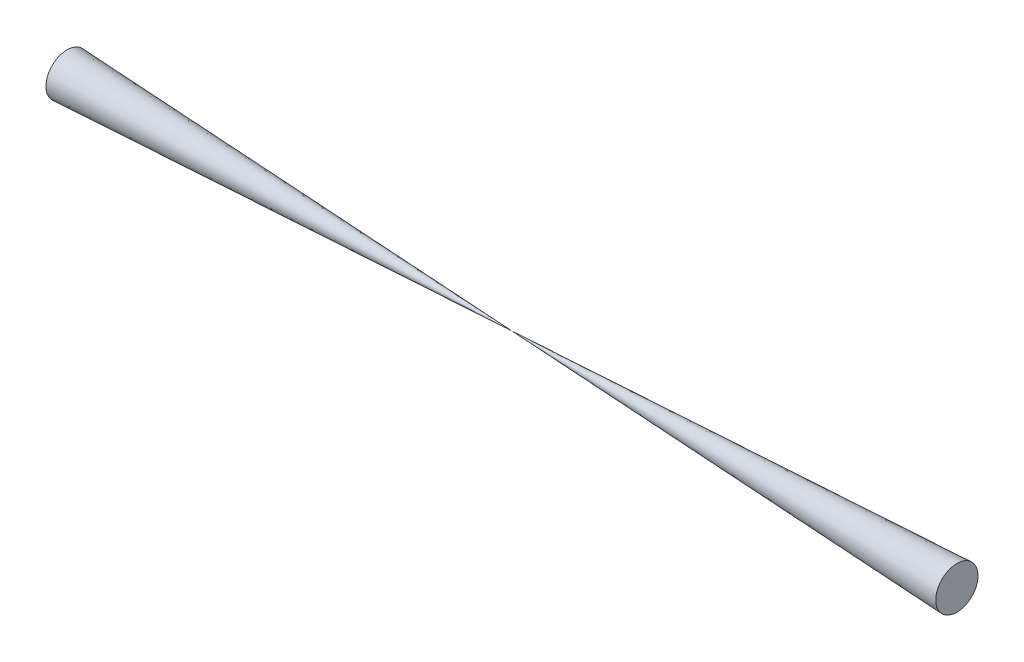
ISO-10303-21;
HEADER;
FILE_DESCRIPTION(('STEP AP214'),'2;1');
FILE_NAME('part.step','',(''),(''),'','','');
FILE_SCHEMA(('AUTOMOTIVE_DESIGN { 1 0 10303 214 1 1 1 1 }'));
ENDSEC;
DATA;
#1=APPLICATION_CONTEXT('core data for automotive mechanical design processes');
#2=APPLICATION_PROTOCOL_DEFINITION('international standard','automotive_design',2000,#1);
#3=PRODUCT_CONTEXT('',#1,'mechanical');
#4=PRODUCT('Part','Part','',(#3));
#5=PRODUCT_RELATED_PRODUCT_CATEGORY('part','',(#4));
#6=PRODUCT_DEFINITION_FORMATION('','',#4);
#7=PRODUCT_DEFINITION_CONTEXT('part definition',#1,'design');
#8=PRODUCT_DEFINITION('design','',#6,#7);
#9=PRODUCT_DEFINITION_SHAPE('','',#8);
#10=(LENGTH_UNIT() NAMED_UNIT(*) SI_UNIT(.MILLI.,.METRE.));
#11=(NAMED_UNIT(*) PLANE_ANGLE_UNIT() SI_UNIT($,.RADIAN.));
#12=(NAMED_UNIT(*) SI_UNIT($,.STERADIAN.) SOLID_ANGLE_UNIT());
#13=UNCERTAINTY_MEASURE_WITH_UNIT(LENGTH_MEASURE(1.E-05),#10,'distance_accuracy_value','');
#14=(GEOMETRIC_REPRESENTATION_CONTEXT(3) GLOBAL_UNCERTAINTY_ASSIGNED_CONTEXT((#13)) GLOBAL_UNIT_ASSIGNED_CONTEXT((#10,
#11,#12)) REPRESENTATION_CONTEXT('',''));
#15=CARTESIAN_POINT('',(0.,0.,0.));
#16=DIRECTION('',(0.,0.,1.));
#17=DIRECTION('',(1.,0.,0.));
#18=AXIS2_PLACEMENT_3D('',#15,#16,#17);
#19=CARTESIAN_POINT('',(200.,0.,0.));
#20=DIRECTION('',(1.,0.,0.));
#21=DIRECTION('',(0.,0.,-1.));
#22=AXIS2_PLACEMENT_3D('',#19,#20,#21);
#23=CONICAL_SURFACE('',#22,9.49999999999998,0.0474393805748933);
#24=CARTESIAN_POINT('',(0.,0.,0.));
#25=DIRECTION('',(1.,0.,0.));
#26=DIRECTION('',(0.,0.,-1.));
#27=AXIS2_PLACEMENT_3D('',#24,#25,#26);
#28=CIRCLE('',#27,0.005);
#29=CARTESIAN_POINT('',(0.,0.,-0.0049999999999998));
#30=VERTEX_POINT('',#29);
#31=EDGE_CURVE('E40',#30,#30,#28,.T.);
#32=CARTESIAN_POINT('',(200.,0.,0.));
#33=DIRECTION('',(1.,0.,0.));
#34=DIRECTION('',(0.,0.,-1.));
#35=AXIS2_PLACEMENT_3D('',#32,#33,#34);
#36=CIRCLE('',#35,9.49999999999998);
#37=CARTESIAN_POINT('',(200.,0.,-9.5));
#38=VERTEX_POINT('',#37);
#39=EDGE_CURVE('E10',#38,#38,#36,.T.);
#40=CARTESIAN_POINT('',(0.,0.,-0.0049999999999998));
#41=CARTESIAN_POINT('',(2.08333333333334,0.,-0.10390625));
#42=CARTESIAN_POINT('',(4.16666666666667,0.,-0.2028125));
#43=CARTESIAN_POINT('',(8.33333333333334,0.,-0.400625));
#44=CARTESIAN_POINT('',(10.4166666666667,0.,-0.49953125));
#45=CARTESIAN_POINT('',(14.5833333333333,0.,-0.69734375));
#46=CARTESIAN_POINT('',(16.6666666666667,0.,-0.79625));
#47=CARTESIAN_POINT('',(20.8333333333333,0.,-0.9940625));
#48=CARTESIAN_POINT('',(22.9166666666667,0.,-1.09296875));
#49=CARTESIAN_POINT('',(27.0833333333333,0.,-1.29078125));
#50=CARTESIAN_POINT('',(29.1666666666667,0.,-1.3896875));
#51=CARTESIAN_POINT('',(33.3333333333333,0.,-1.5875));
#52=CARTESIAN_POINT('',(35.4166666666667,0.,-1.68640625));
#53=CARTESIAN_POINT('',(39.5833333333333,0.,-1.88421875));
#54=CARTESIAN_POINT('',(41.6666666666667,0.,-1.983125));
#55=CARTESIAN_POINT('',(45.8333333333333,0.,-2.1809375));
#56=CARTESIAN_POINT('',(47.9166666666667,0.,-2.27984375));
#57=CARTESIAN_POINT('',(52.0833333333333,0.,-2.47765625));
#58=CARTESIAN_POINT('',(54.1666666666667,0.,-2.5765625));
#59=CARTESIAN_POINT('',(58.3333333333333,0.,-2.774375));
#60=CARTESIAN_POINT('',(60.4166666666667,0.,-2.87328125));
#61=CARTESIAN_POINT('',(64.5833333333333,0.,-3.07109375));
#62=CARTESIAN_POINT('',(66.6666666666667,0.,-3.17));
#63=CARTESIAN_POINT('',(70.8333333333333,0.,-3.3678125));
#64=CARTESIAN_POINT('',(72.9166666666667,0.,-3.46671875));
#65=CARTESIAN_POINT('',(77.0833333333333,0.,-3.66453125));
#66=CARTESIAN_POINT('',(79.1666666666667,0.,-3.7634375));
#67=CARTESIAN_POINT('',(83.3333333333333,0.,-3.96125));
#68=CARTESIAN_POINT('',(85.4166666666667,0.,-4.06015625));
#69=CARTESIAN_POINT('',(89.5833333333333,0.,-4.25796875));
#70=CARTESIAN_POINT('',(91.6666666666667,0.,-4.356875));
#71=CARTESIAN_POINT('',(95.8333333333333,0.,-4.5546875));
#72=CARTESIAN_POINT('',(97.9166666666667,0.,-4.65359375));
#73=CARTESIAN_POINT('',(102.083333333333,0.,-4.85140625));
#74=CARTESIAN_POINT('',(104.166666666667,0.,-4.9503125));
#75=CARTESIAN_POINT('',(108.333333333333,0.,-5.148125));
#76=CARTESIAN_POINT('',(110.416666666667,0.,-5.24703125));
#77=CARTESIAN_POINT('',(114.583333333333,0.,-5.44484375));
#78=CARTESIAN_POINT('',(116.666666666667,0.,-5.54375));
#79=CARTESIAN_POINT('',(120.833333333333,0.,-5.7415625));
#80=CARTESIAN_POINT('',(122.916666666667,0.,-5.84046875));
#81=CARTESIAN_POINT('',(127.083333333333,0.,-6.03828125));
#82=CARTESIAN_POINT('',(129.166666666667,0.,-6.1371875));
#83=CARTESIAN_POINT('',(133.333333333333,0.,-6.335));
#84=CARTESIAN_POINT('',(135.416666666667,0.,-6.43390625));
#85=CARTESIAN_POINT('',(139.583333333333,0.,-6.63171875));
#86=CARTESIAN_POINT('',(141.666666666667,0.,-6.730625));
#87=CARTESIAN_POINT('',(145.833333333333,0.,-6.9284375));
#88=CARTESIAN_POINT('',(147.916666666667,0.,-7.02734375));
#89=CARTESIAN_POINT('',(152.083333333333,0.,-7.22515625));
#90=CARTESIAN_POINT('',(154.166666666667,0.,-7.3240625));
#91=CARTESIAN_POINT('',(158.333333333333,0.,-7.521875));
#92=CARTESIAN_POINT('',(160.416666666667,0.,-7.62078125));
#93=CARTESIAN_POINT('',(164.583333333333,0.,-7.81859375));
#94=CARTESIAN_POINT('',(166.666666666667,0.,-7.9175));
#95=CARTESIAN_POINT('',(170.833333333333,0.,-8.1153125));
#96=CARTESIAN_POINT('',(172.916666666667,0.,-8.21421875));
#97=CARTESIAN_POINT('',(177.083333333333,0.,-8.41203125));
#98=CARTESIAN_POINT('',(179.166666666667,0.,-8.5109375));
#99=CARTESIAN_POINT('',(183.333333333333,0.,-8.70875));
#100=CARTESIAN_POINT('',(185.416666666667,0.,-8.80765625));
#101=CARTESIAN_POINT('',(189.583333333333,0.,-9.00546875));
#102=CARTESIAN_POINT('',(191.666666666667,0.,-9.104375));
#103=CARTESIAN_POINT('',(195.833333333333,0.,-9.3021875));
#104=CARTESIAN_POINT('',(197.916666666667,0.,-9.40109375));
#105=CARTESIAN_POINT('',(200.,0.,-9.5));
#106=B_SPLINE_CURVE_WITH_KNOTS('',3,(#40,#41,#42,#43,#44,#45,#46,#47,#48,#49,#50,#51,#52,#53,
#54,#55,#56,#57,#58,#59,#60,#61,#62,#63,#64,#65,#66,#67,#68,#69,#70,#71,#72,#73,#74,#75,#76,#77,
#78,#79,#80,#81,#82,#83,#84,#85,#86,#87,#88,#89,#90,#91,#92,#93,#94,#95,#96,#97,#98,#99,#100,
#101,#102,#103,#104,#105),.UNSPECIFIED.,.F.,.F.,(4,2,2,2,2,2,2,2,2,2,2,2,2,2,2,2,2,2,2,2,2,2,2,
2,2,2,2,2,2,2,2,2,4),(0.,6.25703939707923,12.5140787941585,18.7711181912377,25.0281575883169,
31.2851969853961,37.5422363824754,43.7992757795546,50.0563151766338,56.313354573713,
62.5703939707923,68.8274333678715,75.0844727649507,81.3415121620299,87.5985515591092,
93.8555909561884,100.112630353268,106.369669750347,112.626709147426,118.883748544505,
125.140787941585,131.397827338664,137.654866735743,143.911906132822,150.168945529901,
156.425984926981,162.68302432406,168.940063721139,175.197103118218,181.454142515298,
187.711181912377,193.968221309456,200.225260706535),.UNSPECIFIED.);
#107=EDGE_CURVE('BSEAM34',#30,#38,#106,.T.);
#108=ORIENTED_EDGE('',*,*,#31,.T.);
#109=ORIENTED_EDGE('',*,*,#39,.F.);
#110=ORIENTED_EDGE('',*,*,#107,.T.);
#111=ORIENTED_EDGE('',*,*,#107,.F.);
#112=EDGE_LOOP('',(#108,#110,#109,#111));
#113=FACE_BOUND('',#112,.T.);
#114=ADVANCED_FACE('F34',(#113),#23,.T.);
#115=CARTESIAN_POINT('',(200.,0.,-9.5));
#116=DIRECTION('',(1.,0.,0.));
#117=DIRECTION('',(0.,0.,-1.));
#118=AXIS2_PLACEMENT_3D('',#115,#116,#117);
#119=PLANE('',#118);
#120=ORIENTED_EDGE('',*,*,#39,.T.);
#121=EDGE_LOOP('',(#120));
#122=FACE_BOUND('',#121,.T.);
#123=ADVANCED_FACE('F59',(#122),#119,.T.);
#124=CARTESIAN_POINT('',(-200.,0.,0.));
#125=DIRECTION('',(-1.,0.,0.));
#126=DIRECTION('',(0.,0.,-1.));
#127=AXIS2_PLACEMENT_3D('',#124,#125,#126);
#128=CONICAL_SURFACE('',#127,9.49999999999998,0.0474393805748933);
#129=CARTESIAN_POINT('',(-200.,0.,0.));
#130=DIRECTION('',(1.,0.,0.));
#131=DIRECTION('',(0.,0.,-1.));
#132=AXIS2_PLACEMENT_3D('',#129,#130,#131);
#133=CIRCLE('',#132,9.49999999999998);
#134=CARTESIAN_POINT('',(-200.,0.,-9.49999999999995));
#135=VERTEX_POINT('',#134);
#136=EDGE_CURVE('E44',#135,#135,#133,.T.);
#137=CARTESIAN_POINT('',(0.,0.,-0.0049999999999998));
#138=CARTESIAN_POINT('',(-2.08333333333334,0.,-0.10390625));
#139=CARTESIAN_POINT('',(-4.16666666666667,0.,-0.202812499999999));
#140=CARTESIAN_POINT('',(-8.33333333333334,0.,-0.400624999999998));
#141=CARTESIAN_POINT('',(-10.4166666666667,0.,-0.499531249999997));
#142=CARTESIAN_POINT('',(-14.5833333333333,0.,-0.697343749999996));
#143=CARTESIAN_POINT('',(-16.6666666666667,0.,-0.796249999999996));
#144=CARTESIAN_POINT('',(-20.8333333333333,0.,-0.994062499999995));
#145=CARTESIAN_POINT('',(-22.9166666666667,0.,-1.09296874999999));
#146=CARTESIAN_POINT('',(-27.0833333333333,0.,-1.29078124999999));
#147=CARTESIAN_POINT('',(-29.1666666666667,0.,-1.38968749999999));
#148=CARTESIAN_POINT('',(-33.3333333333333,0.,-1.58749999999999));
#149=CARTESIAN_POINT('',(-35.4166666666667,0.,-1.68640624999999));
#150=CARTESIAN_POINT('',(-39.5833333333333,0.,-1.88421874999999));
#151=CARTESIAN_POINT('',(-41.6666666666667,0.,-1.98312499999999));
#152=CARTESIAN_POINT('',(-45.8333333333333,0.,-2.18093749999999));
#153=CARTESIAN_POINT('',(-47.9166666666667,0.,-2.27984374999999));
#154=CARTESIAN_POINT('',(-52.0833333333333,0.,-2.47765624999999));
#155=CARTESIAN_POINT('',(-54.1666666666667,0.,-2.57656249999999));
#156=CARTESIAN_POINT('',(-58.3333333333333,0.,-2.77437499999999));
#157=CARTESIAN_POINT('',(-60.4166666666667,0.,-2.87328124999999));
#158=CARTESIAN_POINT('',(-64.5833333333333,0.,-3.07109374999999));
#159=CARTESIAN_POINT('',(-66.6666666666667,0.,-3.16999999999998));
#160=CARTESIAN_POINT('',(-70.8333333333334,0.,-3.36781249999998));
#161=CARTESIAN_POINT('',(-72.9166666666667,0.,-3.46671874999998));
#162=CARTESIAN_POINT('',(-77.0833333333334,0.,-3.66453124999998));
#163=CARTESIAN_POINT('',(-79.1666666666667,0.,-3.76343749999998));
#164=CARTESIAN_POINT('',(-83.3333333333334,0.,-3.96124999999998));
#165=CARTESIAN_POINT('',(-85.4166666666667,0.,-4.06015624999998));
#166=CARTESIAN_POINT('',(-89.5833333333333,0.,-4.25796874999998));
#167=CARTESIAN_POINT('',(-91.6666666666667,0.,-4.35687499999998));
#168=CARTESIAN_POINT('',(-95.8333333333334,0.,-4.55468749999998));
#169=CARTESIAN_POINT('',(-97.9166666666667,0.,-4.65359374999998));
#170=CARTESIAN_POINT('',(-102.083333333333,0.,-4.85140624999998));
#171=CARTESIAN_POINT('',(-104.166666666667,0.,-4.95031249999998));
#172=CARTESIAN_POINT('',(-108.333333333333,0.,-5.14812499999997));
#173=CARTESIAN_POINT('',(-110.416666666667,0.,-5.24703124999998));
#174=CARTESIAN_POINT('',(-114.583333333333,0.,-5.44484374999997));
#175=CARTESIAN_POINT('',(-116.666666666667,0.,-5.54374999999997));
#176=CARTESIAN_POINT('',(-120.833333333333,0.,-5.74156249999997));
#177=CARTESIAN_POINT('',(-122.916666666667,0.,-5.84046874999997));
#178=CARTESIAN_POINT('',(-127.083333333333,0.,-6.03828124999997));
#179=CARTESIAN_POINT('',(-129.166666666667,0.,-6.13718749999997));
#180=CARTESIAN_POINT('',(-133.333333333333,0.,-6.33499999999997));
#181=CARTESIAN_POINT('',(-135.416666666667,0.,-6.43390624999997));
#182=CARTESIAN_POINT('',(-139.583333333333,0.,-6.63171874999997));
#183=CARTESIAN_POINT('',(-141.666666666667,0.,-6.73062499999997));
#184=CARTESIAN_POINT('',(-145.833333333333,0.,-6.92843749999997));
#185=CARTESIAN_POINT('',(-147.916666666667,0.,-7.02734374999997));
#186=CARTESIAN_POINT('',(-152.083333333333,0.,-7.22515624999996));
#187=CARTESIAN_POINT('',(-154.166666666667,0.,-7.32406249999996));
#188=CARTESIAN_POINT('',(-158.333333333333,0.,-7.52187499999996));
#189=CARTESIAN_POINT('',(-160.416666666667,0.,-7.62078124999996));
#190=CARTESIAN_POINT('',(-164.583333333333,0.,-7.81859374999996));
#191=CARTESIAN_POINT('',(-166.666666666667,0.,-7.91749999999996));
#192=CARTESIAN_POINT('',(-170.833333333333,0.,-8.11531249999996));
#193=CARTESIAN_POINT('',(-172.916666666667,0.,-8.21421874999996));
#194=CARTESIAN_POINT('',(-177.083333333333,0.,-8.41203124999996));
#195=CARTESIAN_POINT('',(-179.166666666667,0.,-8.51093749999996));
#196=CARTESIAN_POINT('',(-183.333333333333,0.,-8.70874999999996));
#197=CARTESIAN_POINT('',(-185.416666666667,0.,-8.80765624999996));
#198=CARTESIAN_POINT('',(-189.583333333333,0.,-9.00546874999996));
#199=CARTESIAN_POINT('',(-191.666666666667,0.,-9.10437499999996));
#200=CARTESIAN_POINT('',(-195.833333333333,0.,-9.30218749999995));
#201=CARTESIAN_POINT('',(-197.916666666667,0.,-9.40109374999995));
#202=CARTESIAN_POINT('',(-200.,0.,-9.49999999999995));
#203=B_SPLINE_CURVE_WITH_KNOTS('',3,(#137,#138,#139,#140,#141,#142,#143,#144,#145,#146,#147,
#148,#149,#150,#151,#152,#153,#154,#155,#156,#157,#158,#159,#160,#161,#162,#163,#164,#165,#166,
#167,#168,#169,#170,#171,#172,#173,#174,#175,#176,#177,#178,#179,#180,#181,#182,#183,#184,#185,
#186,#187,#188,#189,#190,#191,#192,#193,#194,#195,#196,#197,#198,#199,#200,#201,#202),
.UNSPECIFIED.,.F.,.F.,(4,2,2,2,2,2,2,2,2,2,2,2,2,2,2,2,2,2,2,2,2,2,2,2,2,2,2,2,2,2,2,2,4),(0.,
6.25703939707923,12.5140787941585,18.7711181912377,25.0281575883169,31.2851969853961,
37.5422363824754,43.7992757795546,50.0563151766338,56.313354573713,62.5703939707923,
68.8274333678715,75.0844727649507,81.34151216203,87.5985515591092,93.8555909561884,
100.112630353268,106.369669750347,112.626709147426,118.883748544505,125.140787941585,
131.397827338664,137.654866735743,143.911906132822,150.168945529901,156.425984926981,
162.68302432406,168.940063721139,175.197103118218,181.454142515298,187.711181912377,
193.968221309456,200.225260706535),.UNSPECIFIED.);
#204=EDGE_CURVE('BSEAM51',#30,#135,#203,.T.);
#205=ORIENTED_EDGE('',*,*,#31,.F.);
#206=ORIENTED_EDGE('',*,*,#136,.T.);
#207=ORIENTED_EDGE('',*,*,#204,.T.);
#208=ORIENTED_EDGE('',*,*,#204,.F.);
#209=EDGE_LOOP('',(#205,#207,#206,#208));
#210=FACE_BOUND('',#209,.T.);
#211=ADVANCED_FACE('F51',(#210),#128,.T.);
#212=CARTESIAN_POINT('',(-200.,0.,-9.49999999999995));
#213=DIRECTION('',(-1.,0.,0.));
#214=DIRECTION('',(0.,0.,-1.));
#215=AXIS2_PLACEMENT_3D('',#212,#213,#214);
#216=PLANE('',#215);
#217=ORIENTED_EDGE('',*,*,#136,.F.);
#218=EDGE_LOOP('',(#217));
#219=FACE_BOUND('',#218,.T.);
#220=ADVANCED_FACE('F53',(#219),#216,.T.);
#221=CLOSED_SHELL('',(#114,#123,#211,#220));
#222=MANIFOLD_SOLID_BREP('B2',#221);
#223=ADVANCED_BREP_SHAPE_REPRESENTATION('',(#18,#222),#14);
#224=SHAPE_DEFINITION_REPRESENTATION(#9,#223);
ENDSEC;
END-ISO-10303-21;
